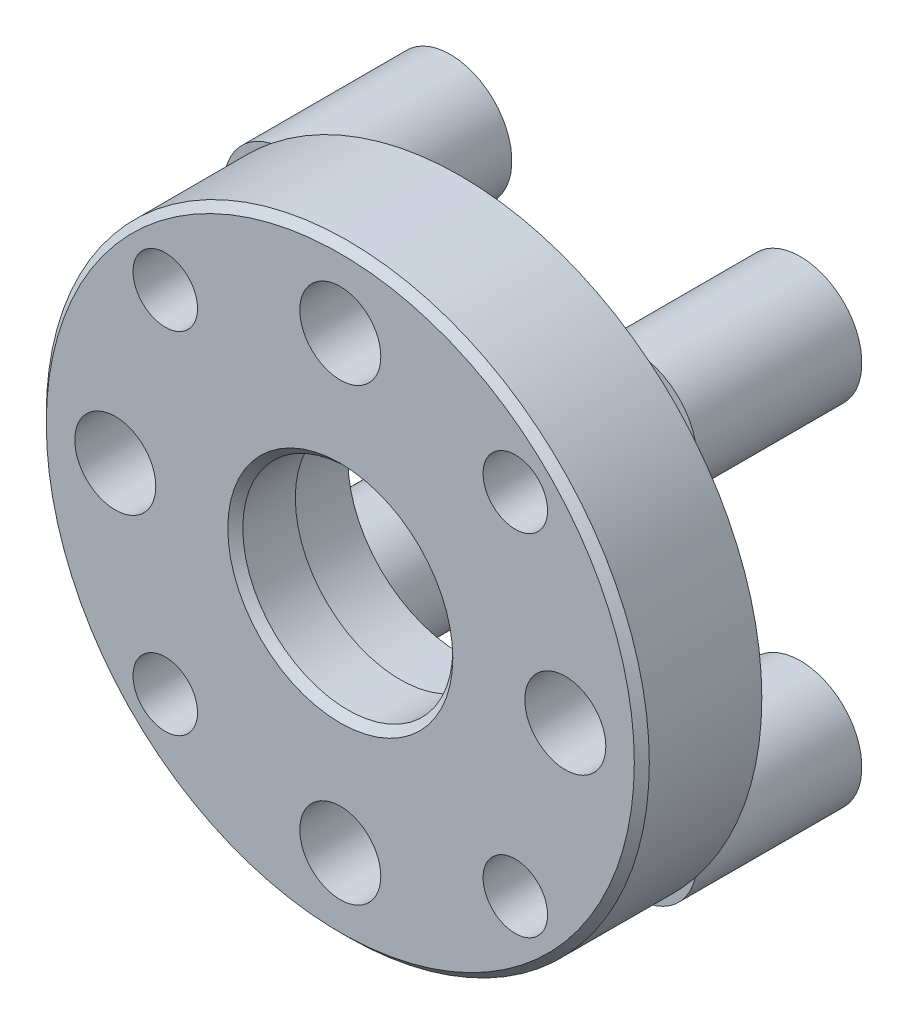
ISO-10303-21;
HEADER;
FILE_DESCRIPTION(('STEP AP214'),'2;1');
FILE_NAME('part.step','',(''),(''),'','','');
FILE_SCHEMA(('AUTOMOTIVE_DESIGN { 1 0 10303 214 1 1 1 1 }'));
ENDSEC;
DATA;
#1=APPLICATION_CONTEXT('core data for automotive mechanical design processes');
#2=APPLICATION_PROTOCOL_DEFINITION('international standard','automotive_design',2000,#1);
#3=PRODUCT_CONTEXT('',#1,'mechanical');
#4=PRODUCT('Part','Part','',(#3));
#5=PRODUCT_RELATED_PRODUCT_CATEGORY('part','',(#4));
#6=PRODUCT_DEFINITION_FORMATION('','',#4);
#7=PRODUCT_DEFINITION_CONTEXT('part definition',#1,'design');
#8=PRODUCT_DEFINITION('design','',#6,#7);
#9=PRODUCT_DEFINITION_SHAPE('','',#8);
#10=(LENGTH_UNIT() NAMED_UNIT(*) SI_UNIT(.MILLI.,.METRE.));
#11=(NAMED_UNIT(*) PLANE_ANGLE_UNIT() SI_UNIT($,.RADIAN.));
#12=(NAMED_UNIT(*) SI_UNIT($,.STERADIAN.) SOLID_ANGLE_UNIT());
#13=UNCERTAINTY_MEASURE_WITH_UNIT(LENGTH_MEASURE(1.E-05),#10,'distance_accuracy_value','');
#14=(GEOMETRIC_REPRESENTATION_CONTEXT(3) GLOBAL_UNCERTAINTY_ASSIGNED_CONTEXT((#13)) GLOBAL_UNIT_ASSIGNED_CONTEXT((#10,
#11,#12)) REPRESENTATION_CONTEXT('',''));
#15=CARTESIAN_POINT('',(0.,0.,0.));
#16=DIRECTION('',(0.,0.,1.));
#17=DIRECTION('',(1.,0.,0.));
#18=AXIS2_PLACEMENT_3D('',#15,#16,#17);
#19=CARTESIAN_POINT('',(0.,0.,-108.757942016732));
#20=DIRECTION('',(0.,0.,-1.));
#21=DIRECTION('',(-1.,0.,0.));
#22=AXIS2_PLACEMENT_3D('',#19,#20,#21);
#23=CYLINDRICAL_SURFACE('',#22,7.5);
#24=CARTESIAN_POINT('',(0.,0.,-116.757942016732));
#25=DIRECTION('',(0.,0.,1.));
#26=DIRECTION('',(1.,0.,0.));
#27=AXIS2_PLACEMENT_3D('',#24,#25,#26);
#28=CIRCLE('',#27,7.5);
#29=CARTESIAN_POINT('',(7.5,0.,-116.757942016732));
#30=VERTEX_POINT('',#29);
#31=EDGE_CURVE('E130',#30,#30,#28,.T.);
#32=ORIENTED_EDGE('',*,*,#31,.F.);
#33=EDGE_LOOP('',(#32));
#34=FACE_BOUND('',#33,.T.);
#35=CARTESIAN_POINT('',(0.,0.,-112.757942016732));
#36=DIRECTION('',(0.,0.,1.));
#37=DIRECTION('',(1.,0.,0.));
#38=AXIS2_PLACEMENT_3D('',#35,#36,#37);
#39=CIRCLE('',#38,7.5);
#40=CARTESIAN_POINT('',(7.5,0.,-112.757942016732));
#41=VERTEX_POINT('',#40);
#42=EDGE_CURVE('E342',#41,#41,#39,.T.);
#43=ORIENTED_EDGE('',*,*,#42,.T.);
#44=EDGE_LOOP('',(#43));
#45=FACE_BOUND('',#44,.T.);
#46=ADVANCED_FACE('F56',(#34,#45),#23,.F.);
#47=CARTESIAN_POINT('',(11.667261889578,-11.667261889578,-127.757942016732));
#48=DIRECTION('',(0.,0.,1.));
#49=DIRECTION('',(1.,0.,0.));
#50=AXIS2_PLACEMENT_3D('',#47,#48,#49);
#51=CYLINDRICAL_SURFACE('',#50,1.6);
#52=CARTESIAN_POINT('',(11.667261889578,-11.667261889578,-124.757942016732));
#53=DIRECTION('',(0.,0.,-1.));
#54=DIRECTION('',(-1.,0.,0.));
#55=AXIS2_PLACEMENT_3D('',#52,#53,#54);
#56=CIRCLE('',#55,1.6);
#57=CARTESIAN_POINT('',(10.067261889578,-11.667261889578,-124.757942016732));
#58=VERTEX_POINT('',#57);
#59=EDGE_CURVE('E133',#58,#58,#56,.F.);
#60=ORIENTED_EDGE('',*,*,#59,.F.);
#61=EDGE_LOOP('',(#60));
#62=FACE_BOUND('',#61,.T.);
#63=CARTESIAN_POINT('',(11.667261889578,-11.667261889578,-116.757942016732));
#64=DIRECTION('',(0.,0.,1.));
#65=DIRECTION('',(1.,0.,0.));
#66=AXIS2_PLACEMENT_3D('',#63,#64,#65);
#67=CIRCLE('',#66,1.6);
#68=CARTESIAN_POINT('',(13.267261889578,-11.667261889578,-116.757942016732));
#69=VERTEX_POINT('',#68);
#70=EDGE_CURVE('E115',#69,#69,#67,.F.);
#71=ORIENTED_EDGE('',*,*,#70,.F.);
#72=EDGE_LOOP('',(#71));
#73=FACE_BOUND('',#72,.T.);
#74=ADVANCED_FACE('F223',(#62,#73),#51,.F.);
#75=CARTESIAN_POINT('',(-11.667261889578,-11.667261889578,-127.757942016732));
#76=DIRECTION('',(0.,0.,1.));
#77=DIRECTION('',(1.,0.,0.));
#78=AXIS2_PLACEMENT_3D('',#75,#76,#77);
#79=CYLINDRICAL_SURFACE('',#78,1.6);
#80=CARTESIAN_POINT('',(-11.667261889578,-11.667261889578,-124.757942016732));
#81=DIRECTION('',(0.,0.,-1.));
#82=DIRECTION('',(-1.,0.,0.));
#83=AXIS2_PLACEMENT_3D('',#80,#81,#82);
#84=CIRCLE('',#83,1.6);
#85=CARTESIAN_POINT('',(-13.267261889578,-11.667261889578,-124.757942016732));
#86=VERTEX_POINT('',#85);
#87=EDGE_CURVE('E477',#86,#86,#84,.F.);
#88=ORIENTED_EDGE('',*,*,#87,.F.);
#89=EDGE_LOOP('',(#88));
#90=FACE_BOUND('',#89,.T.);
#91=CARTESIAN_POINT('',(-11.667261889578,-11.667261889578,-116.757942016732));
#92=DIRECTION('',(0.,0.,1.));
#93=DIRECTION('',(1.,0.,0.));
#94=AXIS2_PLACEMENT_3D('',#91,#92,#93);
#95=CIRCLE('',#94,1.6);
#96=CARTESIAN_POINT('',(-10.067261889578,-11.667261889578,-116.757942016732));
#97=VERTEX_POINT('',#96);
#98=EDGE_CURVE('E464',#97,#97,#95,.F.);
#99=ORIENTED_EDGE('',*,*,#98,.F.);
#100=EDGE_LOOP('',(#99));
#101=FACE_BOUND('',#100,.T.);
#102=ADVANCED_FACE('F231',(#90,#101),#79,.F.);
#103=CARTESIAN_POINT('',(-11.667261889578,11.667261889578,-127.757942016732));
#104=DIRECTION('',(0.,0.,1.));
#105=DIRECTION('',(1.,0.,0.));
#106=AXIS2_PLACEMENT_3D('',#103,#104,#105);
#107=CYLINDRICAL_SURFACE('',#106,1.6);
#108=CARTESIAN_POINT('',(-11.667261889578,11.667261889578,-124.757942016732));
#109=DIRECTION('',(0.,0.,-1.));
#110=DIRECTION('',(-1.,0.,0.));
#111=AXIS2_PLACEMENT_3D('',#108,#109,#110);
#112=CIRCLE('',#111,1.6);
#113=CARTESIAN_POINT('',(-13.267261889578,11.667261889578,-124.757942016732));
#114=VERTEX_POINT('',#113);
#115=EDGE_CURVE('E480',#114,#114,#112,.F.);
#116=ORIENTED_EDGE('',*,*,#115,.F.);
#117=EDGE_LOOP('',(#116));
#118=FACE_BOUND('',#117,.T.);
#119=CARTESIAN_POINT('',(-11.667261889578,11.667261889578,-116.757942016732));
#120=DIRECTION('',(0.,0.,1.));
#121=DIRECTION('',(1.,0.,0.));
#122=AXIS2_PLACEMENT_3D('',#119,#120,#121);
#123=CIRCLE('',#122,1.6);
#124=CARTESIAN_POINT('',(-10.067261889578,11.667261889578,-116.757942016732));
#125=VERTEX_POINT('',#124);
#126=EDGE_CURVE('E461',#125,#125,#123,.F.);
#127=ORIENTED_EDGE('',*,*,#126,.F.);
#128=EDGE_LOOP('',(#127));
#129=FACE_BOUND('',#128,.T.);
#130=ADVANCED_FACE('F447',(#118,#129),#107,.F.);
#131=CARTESIAN_POINT('',(11.667261889578,11.667261889578,-127.757942016732));
#132=DIRECTION('',(0.,0.,1.));
#133=DIRECTION('',(1.,0.,0.));
#134=AXIS2_PLACEMENT_3D('',#131,#132,#133);
#135=CYLINDRICAL_SURFACE('',#134,1.6);
#136=CARTESIAN_POINT('',(11.667261889578,11.667261889578,-124.757942016732));
#137=DIRECTION('',(0.,0.,-1.));
#138=DIRECTION('',(-1.,0.,0.));
#139=AXIS2_PLACEMENT_3D('',#136,#137,#138);
#140=CIRCLE('',#139,1.6);
#141=CARTESIAN_POINT('',(10.067261889578,11.667261889578,-124.757942016732));
#142=VERTEX_POINT('',#141);
#143=EDGE_CURVE('E181',#142,#142,#140,.F.);
#144=ORIENTED_EDGE('',*,*,#143,.F.);
#145=EDGE_LOOP('',(#144));
#146=FACE_BOUND('',#145,.T.);
#147=CARTESIAN_POINT('',(11.667261889578,11.667261889578,-116.757942016732));
#148=DIRECTION('',(0.,0.,1.));
#149=DIRECTION('',(1.,0.,0.));
#150=AXIS2_PLACEMENT_3D('',#147,#148,#149);
#151=CIRCLE('',#150,1.6);
#152=CARTESIAN_POINT('',(13.267261889578,11.667261889578,-116.757942016732));
#153=VERTEX_POINT('',#152);
#154=EDGE_CURVE('E313',#153,#153,#151,.F.);
#155=ORIENTED_EDGE('',*,*,#154,.F.);
#156=EDGE_LOOP('',(#155));
#157=FACE_BOUND('',#156,.T.);
#158=ADVANCED_FACE('F190',(#146,#157),#135,.F.);
#159=CARTESIAN_POINT('',(11.667261889578,11.667261889578,-127.757942016732));
#160=DIRECTION('',(0.,0.,-1.));
#161=DIRECTION('',(-1.,0.,0.));
#162=AXIS2_PLACEMENT_3D('',#159,#160,#161);
#163=PLANE('',#162);
#164=CARTESIAN_POINT('',(11.667261889578,11.667261889578,-127.757942016732));
#165=DIRECTION('',(0.,0.,-1.));
#166=DIRECTION('',(-1.,0.,0.));
#167=AXIS2_PLACEMENT_3D('',#164,#165,#166);
#168=CIRCLE('',#167,3.);
#169=CARTESIAN_POINT('',(8.66726188957803,11.667261889578,-127.757942016732));
#170=VERTEX_POINT('',#169);
#171=EDGE_CURVE('E163',#170,#170,#168,.T.);
#172=ORIENTED_EDGE('',*,*,#171,.F.);
#173=EDGE_LOOP('',(#172));
#174=FACE_BOUND('',#173,.T.);
#175=CARTESIAN_POINT('',(11.667261889578,11.667261889578,-127.757942016732));
#176=DIRECTION('',(0.,0.,-1.));
#177=DIRECTION('',(-1.,0.,0.));
#178=AXIS2_PLACEMENT_3D('',#175,#176,#177);
#179=CIRCLE('',#178,4.1);
#180=CARTESIAN_POINT('',(7.56726188957803,11.667261889578,-127.757942016732));
#181=VERTEX_POINT('',#180);
#182=EDGE_CURVE('E118',#181,#181,#179,.T.);
#183=ORIENTED_EDGE('',*,*,#182,.T.);
#184=EDGE_LOOP('',(#183));
#185=FACE_BOUND('',#184,.T.);
#186=ADVANCED_FACE('F187',(#174,#185),#163,.T.);
#187=CARTESIAN_POINT('',(11.667261889578,11.667261889578,-116.757942016732));
#188=DIRECTION('',(0.,0.,-1.));
#189=DIRECTION('',(-1.,0.,0.));
#190=AXIS2_PLACEMENT_3D('',#187,#188,#189);
#191=PLANE('',#190);
#192=CARTESIAN_POINT('',(0.,0.,-116.757942016732));
#193=DIRECTION('',(0.,0.,1.));
#194=DIRECTION('',(1.,0.,0.));
#195=AXIS2_PLACEMENT_3D('',#192,#193,#194);
#196=CIRCLE('',#195,20.1);
#197=CARTESIAN_POINT('',(15.6594660866061,12.6012349348163,-116.757942016732));
#198=VERTEX_POINT('',#197);
#199=CARTESIAN_POINT('',(12.6012349348163,15.6594660866061,-116.757942016732));
#200=VERTEX_POINT('',#199);
#201=EDGE_CURVE('E95',#198,#200,#196,.T.);
#202=ORIENTED_EDGE('',*,*,#201,.F.);
#203=CARTESIAN_POINT('',(11.667261889578,11.667261889578,-116.757942016732));
#204=DIRECTION('',(0.,0.,-1.));
#205=DIRECTION('',(-1.,0.,0.));
#206=AXIS2_PLACEMENT_3D('',#203,#204,#205);
#207=CIRCLE('',#206,4.1);
#208=EDGE_CURVE('E113',#200,#198,#207,.T.);
#209=ORIENTED_EDGE('',*,*,#208,.F.);
#210=EDGE_LOOP('',(#202,#209));
#211=FACE_BOUND('',#210,.T.);
#212=ADVANCED_FACE('F117',(#211),#191,.F.);
#213=CARTESIAN_POINT('',(0.,0.,-108.757942016732));
#214=DIRECTION('',(0.,0.,1.));
#215=DIRECTION('',(1.,0.,0.));
#216=AXIS2_PLACEMENT_3D('',#213,#214,#215);
#217=PLANE('',#216);
#218=CARTESIAN_POINT('',(0.,0.,-108.757942016732));
#219=DIRECTION('',(0.,0.,1.));
#220=DIRECTION('',(1.,0.,0.));
#221=AXIS2_PLACEMENT_3D('',#218,#219,#220);
#222=CIRCLE('',#221,7.50000000000001);
#223=CARTESIAN_POINT('',(7.50000000000001,0.,-108.757942016732));
#224=VERTEX_POINT('',#223);
#225=EDGE_CURVE('E65',#224,#224,#222,.F.);
#226=ORIENTED_EDGE('',*,*,#225,.T.);
#227=EDGE_LOOP('',(#226));
#228=FACE_BOUND('',#227,.T.);
#229=CARTESIAN_POINT('',(0.,0.,-108.757942016732));
#230=DIRECTION('',(0.,0.,1.));
#231=DIRECTION('',(1.,0.,0.));
#232=AXIS2_PLACEMENT_3D('',#229,#230,#231);
#233=CIRCLE('',#232,19.6);
#234=CARTESIAN_POINT('',(19.6,0.,-108.757942016732));
#235=VERTEX_POINT('',#234);
#236=EDGE_CURVE('E271',#235,#235,#233,.T.);
#237=ORIENTED_EDGE('',*,*,#236,.T.);
#238=EDGE_LOOP('',(#237));
#239=FACE_BOUND('',#238,.T.);
#240=CARTESIAN_POINT('',(15.,0.,-108.757942016732));
#241=DIRECTION('',(0.,0.,1.));
#242=DIRECTION('',(1.,0.,0.));
#243=AXIS2_PLACEMENT_3D('',#240,#241,#242);
#244=CIRCLE('',#243,2.7);
#245=CARTESIAN_POINT('',(17.7,0.,-108.757942016732));
#246=VERTEX_POINT('',#245);
#247=EDGE_CURVE('E283',#246,#246,#244,.T.);
#248=ORIENTED_EDGE('',*,*,#247,.F.);
#249=EDGE_LOOP('',(#248));
#250=FACE_BOUND('',#249,.T.);
#251=CARTESIAN_POINT('',(-1.04744440165294E-13,-15.,-108.757942016732));
#252=DIRECTION('',(0.,0.,1.));
#253=DIRECTION('',(1.,0.,0.));
#254=AXIS2_PLACEMENT_3D('',#251,#252,#253);
#255=CIRCLE('',#254,2.7);
#256=CARTESIAN_POINT('',(2.6999999999999,-15.,-108.757942016732));
#257=VERTEX_POINT('',#256);
#258=EDGE_CURVE('E287',#257,#257,#255,.T.);
#259=ORIENTED_EDGE('',*,*,#258,.F.);
#260=EDGE_LOOP('',(#259));
#261=FACE_BOUND('',#260,.T.);
#262=CARTESIAN_POINT('',(-15.,1.57116660247941E-13,-108.757942016732));
#263=DIRECTION('',(0.,0.,1.));
#264=DIRECTION('',(1.,0.,0.));
#265=AXIS2_PLACEMENT_3D('',#262,#263,#264);
#266=CIRCLE('',#265,2.7);
#267=CARTESIAN_POINT('',(-12.3,1.57116660247941E-13,-108.757942016732));
#268=VERTEX_POINT('',#267);
#269=EDGE_CURVE('E291',#268,#268,#266,.T.);
#270=ORIENTED_EDGE('',*,*,#269,.F.);
#271=EDGE_LOOP('',(#270));
#272=FACE_BOUND('',#271,.T.);
#273=CARTESIAN_POINT('',(-11.667261889578,11.667261889578,-108.757942016732));
#274=DIRECTION('',(0.,0.,1.));
#275=DIRECTION('',(1.,0.,0.));
#276=AXIS2_PLACEMENT_3D('',#273,#274,#275);
#277=CIRCLE('',#276,2.15);
#278=CARTESIAN_POINT('',(-9.51726188957804,11.667261889578,-108.757942016732));
#279=VERTEX_POINT('',#278);
#280=EDGE_CURVE('E295',#279,#279,#277,.T.);
#281=ORIENTED_EDGE('',*,*,#280,.F.);
#282=EDGE_LOOP('',(#281));
#283=FACE_BOUND('',#282,.T.);
#284=CARTESIAN_POINT('',(11.667261889578,11.667261889578,-108.757942016732));
#285=DIRECTION('',(0.,0.,1.));
#286=DIRECTION('',(1.,0.,0.));
#287=AXIS2_PLACEMENT_3D('',#284,#285,#286);
#288=CIRCLE('',#287,2.15);
#289=CARTESIAN_POINT('',(13.817261889578,11.667261889578,-108.757942016732));
#290=VERTEX_POINT('',#289);
#291=EDGE_CURVE('E299',#290,#290,#288,.T.);
#292=ORIENTED_EDGE('',*,*,#291,.F.);
#293=EDGE_LOOP('',(#292));
#294=FACE_BOUND('',#293,.T.);
#295=CARTESIAN_POINT('',(11.667261889578,-11.667261889578,-108.757942016732));
#296=DIRECTION('',(0.,0.,1.));
#297=DIRECTION('',(1.,0.,0.));
#298=AXIS2_PLACEMENT_3D('',#295,#296,#297);
#299=CIRCLE('',#298,2.15);
#300=CARTESIAN_POINT('',(13.817261889578,-11.667261889578,-108.757942016732));
#301=VERTEX_POINT('',#300);
#302=EDGE_CURVE('E303',#301,#301,#299,.T.);
#303=ORIENTED_EDGE('',*,*,#302,.F.);
#304=EDGE_LOOP('',(#303));
#305=FACE_BOUND('',#304,.T.);
#306=CARTESIAN_POINT('',(-11.667261889578,-11.667261889578,-108.757942016732));
#307=DIRECTION('',(0.,0.,1.));
#308=DIRECTION('',(1.,0.,0.));
#309=AXIS2_PLACEMENT_3D('',#306,#307,#308);
#310=CIRCLE('',#309,2.15);
#311=CARTESIAN_POINT('',(-9.51726188957803,-11.667261889578,-108.757942016732));
#312=VERTEX_POINT('',#311);
#313=EDGE_CURVE('E307',#312,#312,#310,.T.);
#314=ORIENTED_EDGE('',*,*,#313,.F.);
#315=EDGE_LOOP('',(#314));
#316=FACE_BOUND('',#315,.T.);
#317=CARTESIAN_POINT('',(0.,15.,-108.757942016732));
#318=DIRECTION('',(0.,0.,1.));
#319=DIRECTION('',(1.,0.,0.));
#320=AXIS2_PLACEMENT_3D('',#317,#318,#319);
#321=CIRCLE('',#320,2.7);
#322=CARTESIAN_POINT('',(2.7,15.,-108.757942016732));
#323=VERTEX_POINT('',#322);
#324=EDGE_CURVE('E199',#323,#323,#321,.T.);
#325=ORIENTED_EDGE('',*,*,#324,.F.);
#326=EDGE_LOOP('',(#325));
#327=FACE_BOUND('',#326,.T.);
#328=ADVANCED_FACE('F240',(#228,#239,#250,#261,#272,#283,#294,#305,#316,#327),#217,.T.);
#329=CARTESIAN_POINT('',(0.,0.,-116.757942016732));
#330=DIRECTION('',(0.,0.,1.));
#331=DIRECTION('',(1.,0.,0.));
#332=AXIS2_PLACEMENT_3D('',#329,#330,#331);
#333=PLANE('',#332);
#334=CARTESIAN_POINT('',(15.,0.,-116.757942016732));
#335=DIRECTION('',(0.,0.,1.));
#336=DIRECTION('',(1.,0.,0.));
#337=AXIS2_PLACEMENT_3D('',#334,#335,#336);
#338=CIRCLE('',#337,2.7);
#339=CARTESIAN_POINT('',(17.7,0.,-116.757942016732));
#340=VERTEX_POINT('',#339);
#341=EDGE_CURVE('E314',#340,#340,#338,.T.);
#342=ORIENTED_EDGE('',*,*,#341,.T.);
#343=EDGE_LOOP('',(#342));
#344=FACE_BOUND('',#343,.T.);
#345=CARTESIAN_POINT('',(-1.04744440165294E-13,-15.,-116.757942016732));
#346=DIRECTION('',(0.,0.,1.));
#347=DIRECTION('',(1.,0.,0.));
#348=AXIS2_PLACEMENT_3D('',#345,#346,#347);
#349=CIRCLE('',#348,2.7);
#350=CARTESIAN_POINT('',(2.6999999999999,-15.,-116.757942016732));
#351=VERTEX_POINT('',#350);
#352=EDGE_CURVE('E324',#351,#351,#349,.T.);
#353=ORIENTED_EDGE('',*,*,#352,.T.);
#354=EDGE_LOOP('',(#353));
#355=FACE_BOUND('',#354,.T.);
#356=CARTESIAN_POINT('',(-15.,1.57116660247941E-13,-116.757942016732));
#357=DIRECTION('',(0.,0.,1.));
#358=DIRECTION('',(1.,0.,0.));
#359=AXIS2_PLACEMENT_3D('',#356,#357,#358);
#360=CIRCLE('',#359,2.7);
#361=CARTESIAN_POINT('',(-12.3,1.57116660247941E-13,-116.757942016732));
#362=VERTEX_POINT('',#361);
#363=EDGE_CURVE('E328',#362,#362,#360,.T.);
#364=ORIENTED_EDGE('',*,*,#363,.T.);
#365=EDGE_LOOP('',(#364));
#366=FACE_BOUND('',#365,.T.);
#367=CARTESIAN_POINT('',(0.,15.,-116.757942016732));
#368=DIRECTION('',(0.,0.,1.));
#369=DIRECTION('',(1.,0.,0.));
#370=AXIS2_PLACEMENT_3D('',#367,#368,#369);
#371=CIRCLE('',#370,2.7);
#372=CARTESIAN_POINT('',(2.7,15.,-116.757942016732));
#373=VERTEX_POINT('',#372);
#374=EDGE_CURVE('E311',#373,#373,#371,.T.);
#375=ORIENTED_EDGE('',*,*,#374,.T.);
#376=EDGE_LOOP('',(#375));
#377=FACE_BOUND('',#376,.T.);
#378=CARTESIAN_POINT('',(-12.6012349348163,15.6594660866061,-116.757942016732));
#379=VERTEX_POINT('',#378);
#380=EDGE_CURVE('E99',#200,#379,#196,.T.);
#381=ORIENTED_EDGE('',*,*,#380,.F.);
#382=EDGE_CURVE('E110',#198,#200,#207,.T.);
#383=ORIENTED_EDGE('',*,*,#382,.F.);
#384=CARTESIAN_POINT('',(15.6594660866061,-12.6012349348163,-116.757942016732));
#385=VERTEX_POINT('',#384);
#386=EDGE_CURVE('E101',#385,#198,#196,.T.);
#387=ORIENTED_EDGE('',*,*,#386,.F.);
#388=CARTESIAN_POINT('',(11.667261889578,-11.667261889578,-116.757942016732));
#389=DIRECTION('',(0.,0.,-1.));
#390=DIRECTION('',(-1.,0.,0.));
#391=AXIS2_PLACEMENT_3D('',#388,#389,#390);
#392=CIRCLE('',#391,4.1);
#393=CARTESIAN_POINT('',(12.6012349348163,-15.6594660866061,-116.757942016732));
#394=VERTEX_POINT('',#393);
#395=EDGE_CURVE('E194',#394,#385,#392,.T.);
#396=ORIENTED_EDGE('',*,*,#395,.F.);
#397=CARTESIAN_POINT('',(-12.6012349348162,-15.6594660866061,-116.757942016732));
#398=VERTEX_POINT('',#397);
#399=EDGE_CURVE('E131',#398,#394,#196,.T.);
#400=ORIENTED_EDGE('',*,*,#399,.F.);
#401=CARTESIAN_POINT('',(-11.667261889578,-11.667261889578,-116.757942016732));
#402=DIRECTION('',(0.,0.,-1.));
#403=DIRECTION('',(-1.,0.,0.));
#404=AXIS2_PLACEMENT_3D('',#401,#402,#403);
#405=CIRCLE('',#404,4.1);
#406=CARTESIAN_POINT('',(-15.6594660866061,-12.6012349348163,-116.757942016732));
#407=VERTEX_POINT('',#406);
#408=EDGE_CURVE('E145',#407,#398,#405,.T.);
#409=ORIENTED_EDGE('',*,*,#408,.F.);
#410=CARTESIAN_POINT('',(-15.6594660866061,12.6012349348162,-116.757942016732));
#411=VERTEX_POINT('',#410);
#412=EDGE_CURVE('E126',#411,#407,#196,.T.);
#413=ORIENTED_EDGE('',*,*,#412,.F.);
#414=CARTESIAN_POINT('',(-11.667261889578,11.667261889578,-116.757942016732));
#415=DIRECTION('',(0.,0.,-1.));
#416=DIRECTION('',(-1.,0.,0.));
#417=AXIS2_PLACEMENT_3D('',#414,#415,#416);
#418=CIRCLE('',#417,4.1);
#419=EDGE_CURVE('E124',#379,#411,#418,.T.);
#420=ORIENTED_EDGE('',*,*,#419,.F.);
#421=EDGE_LOOP('',(#381,#383,#387,#396,#400,#409,#413,#420));
#422=FACE_BOUND('',#421,.T.);
#423=ORIENTED_EDGE('',*,*,#31,.T.);
#424=EDGE_LOOP('',(#423));
#425=FACE_BOUND('',#424,.T.);
#426=ADVANCED_FACE('F120',(#344,#355,#366,#377,#422,#425),#333,.F.);
#427=CARTESIAN_POINT('',(0.,0.,-108.757942016732));
#428=DIRECTION('',(0.,0.,-1.));
#429=DIRECTION('',(-1.,0.,0.));
#430=AXIS2_PLACEMENT_3D('',#427,#428,#429);
#431=CYLINDRICAL_SURFACE('',#430,20.1);
#432=CARTESIAN_POINT('',(0.,0.,-109.257942016732));
#433=DIRECTION('',(0.,0.,1.));
#434=DIRECTION('',(1.,0.,0.));
#435=AXIS2_PLACEMENT_3D('',#432,#433,#434);
#436=CIRCLE('',#435,20.1);
#437=CARTESIAN_POINT('',(20.1,0.,-109.257942016732));
#438=VERTEX_POINT('',#437);
#439=EDGE_CURVE('E12',#438,#438,#436,.F.);
#440=ORIENTED_EDGE('',*,*,#439,.T.);
#441=EDGE_LOOP('',(#440));
#442=FACE_BOUND('',#441,.T.);
#443=ORIENTED_EDGE('',*,*,#201,.T.);
#444=ORIENTED_EDGE('',*,*,#380,.T.);
#445=EDGE_CURVE('E107',#379,#411,#196,.T.);
#446=ORIENTED_EDGE('',*,*,#445,.T.);
#447=ORIENTED_EDGE('',*,*,#412,.T.);
#448=EDGE_CURVE('E127',#407,#398,#196,.T.);
#449=ORIENTED_EDGE('',*,*,#448,.T.);
#450=ORIENTED_EDGE('',*,*,#399,.T.);
#451=EDGE_CURVE('E72',#394,#385,#196,.T.);
#452=ORIENTED_EDGE('',*,*,#451,.T.);
#453=ORIENTED_EDGE('',*,*,#386,.T.);
#454=EDGE_LOOP('',(#443,#444,#446,#447,#449,#450,#452,#453));
#455=FACE_BOUND('',#454,.T.);
#456=ADVANCED_FACE('F97',(#442,#455),#431,.T.);
#457=CARTESIAN_POINT('',(-11.667261889578,11.667261889578,-127.757942016732));
#458=DIRECTION('',(0.,0.,-1.));
#459=DIRECTION('',(-1.,0.,0.));
#460=AXIS2_PLACEMENT_3D('',#457,#458,#459);
#461=PLANE('',#460);
#462=CARTESIAN_POINT('',(-11.667261889578,11.667261889578,-127.757942016732));
#463=DIRECTION('',(0.,0.,-1.));
#464=DIRECTION('',(-1.,0.,0.));
#465=AXIS2_PLACEMENT_3D('',#462,#463,#464);
#466=CIRCLE('',#465,3.);
#467=CARTESIAN_POINT('',(-14.667261889578,11.667261889578,-127.757942016732));
#468=VERTEX_POINT('',#467);
#469=EDGE_CURVE('E173',#468,#468,#466,.T.);
#470=ORIENTED_EDGE('',*,*,#469,.F.);
#471=EDGE_LOOP('',(#470));
#472=FACE_BOUND('',#471,.T.);
#473=CARTESIAN_POINT('',(-11.667261889578,11.667261889578,-127.757942016732));
#474=DIRECTION('',(0.,0.,-1.));
#475=DIRECTION('',(-1.,0.,0.));
#476=AXIS2_PLACEMENT_3D('',#473,#474,#475);
#477=CIRCLE('',#476,4.1);
#478=CARTESIAN_POINT('',(-15.767261889578,11.667261889578,-127.757942016732));
#479=VERTEX_POINT('',#478);
#480=EDGE_CURVE('E150',#479,#479,#477,.T.);
#481=ORIENTED_EDGE('',*,*,#480,.T.);
#482=EDGE_LOOP('',(#481));
#483=FACE_BOUND('',#482,.T.);
#484=ADVANCED_FACE('F238',(#472,#483),#461,.T.);
#485=CARTESIAN_POINT('',(-11.667261889578,11.667261889578,-116.757942016732));
#486=DIRECTION('',(0.,0.,-1.));
#487=DIRECTION('',(-1.,0.,0.));
#488=AXIS2_PLACEMENT_3D('',#485,#486,#487);
#489=PLANE('',#488);
#490=ORIENTED_EDGE('',*,*,#445,.F.);
#491=EDGE_CURVE('E155',#411,#379,#418,.T.);
#492=ORIENTED_EDGE('',*,*,#491,.F.);
#493=EDGE_LOOP('',(#490,#492));
#494=FACE_BOUND('',#493,.T.);
#495=ADVANCED_FACE('F680',(#494),#489,.F.);
#496=CARTESIAN_POINT('',(-11.667261889578,-11.667261889578,-127.757942016732));
#497=DIRECTION('',(0.,0.,-1.));
#498=DIRECTION('',(-1.,0.,0.));
#499=AXIS2_PLACEMENT_3D('',#496,#497,#498);
#500=PLANE('',#499);
#501=CARTESIAN_POINT('',(-11.667261889578,-11.667261889578,-127.757942016732));
#502=DIRECTION('',(0.,0.,-1.));
#503=DIRECTION('',(-1.,0.,0.));
#504=AXIS2_PLACEMENT_3D('',#501,#502,#503);
#505=CIRCLE('',#504,3.);
#506=CARTESIAN_POINT('',(-14.667261889578,-11.667261889578,-127.757942016732));
#507=VERTEX_POINT('',#506);
#508=EDGE_CURVE('E167',#507,#507,#505,.T.);
#509=ORIENTED_EDGE('',*,*,#508,.F.);
#510=EDGE_LOOP('',(#509));
#511=FACE_BOUND('',#510,.T.);
#512=CARTESIAN_POINT('',(-11.667261889578,-11.667261889578,-127.757942016732));
#513=DIRECTION('',(0.,0.,-1.));
#514=DIRECTION('',(-1.,0.,0.));
#515=AXIS2_PLACEMENT_3D('',#512,#513,#514);
#516=CIRCLE('',#515,4.1);
#517=CARTESIAN_POINT('',(-15.767261889578,-11.667261889578,-127.757942016732));
#518=VERTEX_POINT('',#517);
#519=EDGE_CURVE('E147',#518,#518,#516,.T.);
#520=ORIENTED_EDGE('',*,*,#519,.T.);
#521=EDGE_LOOP('',(#520));
#522=FACE_BOUND('',#521,.T.);
#523=ADVANCED_FACE('F689',(#511,#522),#500,.T.);
#524=CARTESIAN_POINT('',(-11.667261889578,-11.667261889578,-116.757942016732));
#525=DIRECTION('',(0.,0.,-1.));
#526=DIRECTION('',(-1.,0.,0.));
#527=AXIS2_PLACEMENT_3D('',#524,#525,#526);
#528=PLANE('',#527);
#529=ORIENTED_EDGE('',*,*,#448,.F.);
#530=EDGE_CURVE('E142',#398,#407,#405,.T.);
#531=ORIENTED_EDGE('',*,*,#530,.F.);
#532=EDGE_LOOP('',(#529,#531));
#533=FACE_BOUND('',#532,.T.);
#534=ADVANCED_FACE('F218',(#533),#528,.F.);
#535=CARTESIAN_POINT('',(11.667261889578,-11.667261889578,-127.757942016732));
#536=DIRECTION('',(0.,0.,-1.));
#537=DIRECTION('',(-1.,0.,0.));
#538=AXIS2_PLACEMENT_3D('',#535,#536,#537);
#539=PLANE('',#538);
#540=CARTESIAN_POINT('',(11.667261889578,-11.667261889578,-127.757942016732));
#541=DIRECTION('',(0.,0.,-1.));
#542=DIRECTION('',(-1.,0.,0.));
#543=AXIS2_PLACEMENT_3D('',#540,#541,#542);
#544=CIRCLE('',#543,3.);
#545=CARTESIAN_POINT('',(8.66726188957804,-11.667261889578,-127.757942016732));
#546=VERTEX_POINT('',#545);
#547=EDGE_CURVE('E160',#546,#546,#544,.T.);
#548=ORIENTED_EDGE('',*,*,#547,.F.);
#549=EDGE_LOOP('',(#548));
#550=FACE_BOUND('',#549,.T.);
#551=CARTESIAN_POINT('',(11.667261889578,-11.667261889578,-127.757942016732));
#552=DIRECTION('',(0.,0.,-1.));
#553=DIRECTION('',(-1.,0.,0.));
#554=AXIS2_PLACEMENT_3D('',#551,#552,#553);
#555=CIRCLE('',#554,4.1);
#556=CARTESIAN_POINT('',(7.56726188957804,-11.667261889578,-127.757942016732));
#557=VERTEX_POINT('',#556);
#558=EDGE_CURVE('E152',#557,#557,#555,.T.);
#559=ORIENTED_EDGE('',*,*,#558,.T.);
#560=EDGE_LOOP('',(#559));
#561=FACE_BOUND('',#560,.T.);
#562=ADVANCED_FACE('F209',(#550,#561),#539,.T.);
#563=CARTESIAN_POINT('',(11.667261889578,-11.667261889578,-116.757942016732));
#564=DIRECTION('',(0.,0.,-1.));
#565=DIRECTION('',(-1.,0.,0.));
#566=AXIS2_PLACEMENT_3D('',#563,#564,#565);
#567=PLANE('',#566);
#568=ORIENTED_EDGE('',*,*,#451,.F.);
#569=EDGE_CURVE('E197',#385,#394,#392,.T.);
#570=ORIENTED_EDGE('',*,*,#569,.F.);
#571=EDGE_LOOP('',(#568,#570));
#572=FACE_BOUND('',#571,.T.);
#573=ADVANCED_FACE('F206',(#572),#567,.F.);
#574=CARTESIAN_POINT('',(11.667261889578,11.667261889578,-124.757942016732));
#575=DIRECTION('',(0.,0.,-1.));
#576=DIRECTION('',(-1.,0.,0.));
#577=AXIS2_PLACEMENT_3D('',#574,#575,#576);
#578=PLANE('',#577);
#579=CARTESIAN_POINT('',(11.667261889578,11.667261889578,-124.757942016732));
#580=DIRECTION('',(0.,0.,-1.));
#581=DIRECTION('',(-1.,0.,0.));
#582=AXIS2_PLACEMENT_3D('',#579,#580,#581);
#583=CIRCLE('',#582,3.);
#584=CARTESIAN_POINT('',(8.66726188957803,11.667261889578,-124.757942016732));
#585=VERTEX_POINT('',#584);
#586=EDGE_CURVE('E178',#585,#585,#583,.T.);
#587=ORIENTED_EDGE('',*,*,#586,.T.);
#588=EDGE_LOOP('',(#587));
#589=FACE_BOUND('',#588,.T.);
#590=ORIENTED_EDGE('',*,*,#143,.T.);
#591=EDGE_LOOP('',(#590));
#592=FACE_BOUND('',#591,.T.);
#593=ADVANCED_FACE('F208',(#589,#592),#578,.T.);
#594=CARTESIAN_POINT('',(11.667261889578,11.667261889578,-124.757942016732));
#595=DIRECTION('',(0.,0.,-1.));
#596=DIRECTION('',(-1.,0.,0.));
#597=AXIS2_PLACEMENT_3D('',#594,#595,#596);
#598=CYLINDRICAL_SURFACE('',#597,3.);
#599=ORIENTED_EDGE('',*,*,#586,.F.);
#600=EDGE_LOOP('',(#599));
#601=FACE_BOUND('',#600,.T.);
#602=ORIENTED_EDGE('',*,*,#171,.T.);
#603=EDGE_LOOP('',(#602));
#604=FACE_BOUND('',#603,.T.);
#605=ADVANCED_FACE('F185',(#601,#604),#598,.F.);
#606=CARTESIAN_POINT('',(-11.667261889578,11.667261889578,-124.757942016732));
#607=DIRECTION('',(0.,0.,-1.));
#608=DIRECTION('',(-1.,0.,0.));
#609=AXIS2_PLACEMENT_3D('',#606,#607,#608);
#610=PLANE('',#609);
#611=CARTESIAN_POINT('',(-11.667261889578,11.667261889578,-124.757942016732));
#612=DIRECTION('',(0.,0.,-1.));
#613=DIRECTION('',(-1.,0.,0.));
#614=AXIS2_PLACEMENT_3D('',#611,#612,#613);
#615=CIRCLE('',#614,3.);
#616=CARTESIAN_POINT('',(-14.667261889578,11.667261889578,-124.757942016732));
#617=VERTEX_POINT('',#616);
#618=EDGE_CURVE('E157',#617,#617,#615,.T.);
#619=ORIENTED_EDGE('',*,*,#618,.T.);
#620=EDGE_LOOP('',(#619));
#621=FACE_BOUND('',#620,.T.);
#622=ORIENTED_EDGE('',*,*,#115,.T.);
#623=EDGE_LOOP('',(#622));
#624=FACE_BOUND('',#623,.T.);
#625=ADVANCED_FACE('F437',(#621,#624),#610,.T.);
#626=CARTESIAN_POINT('',(-11.667261889578,11.667261889578,-124.757942016732));
#627=DIRECTION('',(0.,0.,-1.));
#628=DIRECTION('',(-1.,0.,0.));
#629=AXIS2_PLACEMENT_3D('',#626,#627,#628);
#630=CYLINDRICAL_SURFACE('',#629,3.);
#631=ORIENTED_EDGE('',*,*,#618,.F.);
#632=EDGE_LOOP('',(#631));
#633=FACE_BOUND('',#632,.T.);
#634=ORIENTED_EDGE('',*,*,#469,.T.);
#635=EDGE_LOOP('',(#634));
#636=FACE_BOUND('',#635,.T.);
#637=ADVANCED_FACE('F433',(#633,#636),#630,.F.);
#638=CARTESIAN_POINT('',(-11.667261889578,-11.667261889578,-124.757942016732));
#639=DIRECTION('',(0.,0.,-1.));
#640=DIRECTION('',(-1.,0.,0.));
#641=AXIS2_PLACEMENT_3D('',#638,#639,#640);
#642=PLANE('',#641);
#643=CARTESIAN_POINT('',(-11.667261889578,-11.667261889578,-124.757942016732));
#644=DIRECTION('',(0.,0.,-1.));
#645=DIRECTION('',(-1.,0.,0.));
#646=AXIS2_PLACEMENT_3D('',#643,#644,#645);
#647=CIRCLE('',#646,3.);
#648=CARTESIAN_POINT('',(-14.667261889578,-11.667261889578,-124.757942016732));
#649=VERTEX_POINT('',#648);
#650=EDGE_CURVE('E170',#649,#649,#647,.T.);
#651=ORIENTED_EDGE('',*,*,#650,.T.);
#652=EDGE_LOOP('',(#651));
#653=FACE_BOUND('',#652,.T.);
#654=ORIENTED_EDGE('',*,*,#87,.T.);
#655=EDGE_LOOP('',(#654));
#656=FACE_BOUND('',#655,.T.);
#657=ADVANCED_FACE('F429',(#653,#656),#642,.T.);
#658=CARTESIAN_POINT('',(-11.667261889578,-11.667261889578,-124.757942016732));
#659=DIRECTION('',(0.,0.,-1.));
#660=DIRECTION('',(-1.,0.,0.));
#661=AXIS2_PLACEMENT_3D('',#658,#659,#660);
#662=CYLINDRICAL_SURFACE('',#661,3.);
#663=ORIENTED_EDGE('',*,*,#650,.F.);
#664=EDGE_LOOP('',(#663));
#665=FACE_BOUND('',#664,.T.);
#666=ORIENTED_EDGE('',*,*,#508,.T.);
#667=EDGE_LOOP('',(#666));
#668=FACE_BOUND('',#667,.T.);
#669=ADVANCED_FACE('F425',(#665,#668),#662,.F.);
#670=CARTESIAN_POINT('',(11.667261889578,-11.667261889578,-124.757942016732));
#671=DIRECTION('',(0.,0.,-1.));
#672=DIRECTION('',(-1.,0.,0.));
#673=AXIS2_PLACEMENT_3D('',#670,#671,#672);
#674=PLANE('',#673);
#675=CARTESIAN_POINT('',(11.667261889578,-11.667261889578,-124.757942016732));
#676=DIRECTION('',(0.,0.,-1.));
#677=DIRECTION('',(-1.,0.,0.));
#678=AXIS2_PLACEMENT_3D('',#675,#676,#677);
#679=CIRCLE('',#678,3.);
#680=CARTESIAN_POINT('',(8.66726188957804,-11.667261889578,-124.757942016732));
#681=VERTEX_POINT('',#680);
#682=EDGE_CURVE('E164',#681,#681,#679,.T.);
#683=ORIENTED_EDGE('',*,*,#682,.T.);
#684=EDGE_LOOP('',(#683));
#685=FACE_BOUND('',#684,.T.);
#686=ORIENTED_EDGE('',*,*,#59,.T.);
#687=EDGE_LOOP('',(#686));
#688=FACE_BOUND('',#687,.T.);
#689=ADVANCED_FACE('F421',(#685,#688),#674,.T.);
#690=CARTESIAN_POINT('',(11.667261889578,-11.667261889578,-124.757942016732));
#691=DIRECTION('',(0.,0.,-1.));
#692=DIRECTION('',(-1.,0.,0.));
#693=AXIS2_PLACEMENT_3D('',#690,#691,#692);
#694=CYLINDRICAL_SURFACE('',#693,3.);
#695=ORIENTED_EDGE('',*,*,#682,.F.);
#696=EDGE_LOOP('',(#695));
#697=FACE_BOUND('',#696,.T.);
#698=ORIENTED_EDGE('',*,*,#547,.T.);
#699=EDGE_LOOP('',(#698));
#700=FACE_BOUND('',#699,.T.);
#701=ADVANCED_FACE('F417',(#697,#700),#694,.F.);
#702=CARTESIAN_POINT('',(-11.667261889578,11.667261889578,-116.757942016732));
#703=DIRECTION('',(0.,0.,-1.));
#704=DIRECTION('',(-1.,0.,0.));
#705=AXIS2_PLACEMENT_3D('',#702,#703,#704);
#706=CYLINDRICAL_SURFACE('',#705,4.1);
#707=ORIENTED_EDGE('',*,*,#491,.T.);
#708=ORIENTED_EDGE('',*,*,#419,.T.);
#709=EDGE_LOOP('',(#707,#708));
#710=FACE_BOUND('',#709,.T.);
#711=ORIENTED_EDGE('',*,*,#480,.F.);
#712=EDGE_LOOP('',(#711));
#713=FACE_BOUND('',#712,.T.);
#714=ADVANCED_FACE('F415',(#710,#713),#706,.T.);
#715=CARTESIAN_POINT('',(-11.667261889578,-11.667261889578,-116.757942016732));
#716=DIRECTION('',(0.,0.,-1.));
#717=DIRECTION('',(-1.,0.,0.));
#718=AXIS2_PLACEMENT_3D('',#715,#716,#717);
#719=CYLINDRICAL_SURFACE('',#718,4.1);
#720=ORIENTED_EDGE('',*,*,#530,.T.);
#721=ORIENTED_EDGE('',*,*,#408,.T.);
#722=EDGE_LOOP('',(#720,#721));
#723=FACE_BOUND('',#722,.T.);
#724=ORIENTED_EDGE('',*,*,#519,.F.);
#725=EDGE_LOOP('',(#724));
#726=FACE_BOUND('',#725,.T.);
#727=ADVANCED_FACE('F143',(#723,#726),#719,.T.);
#728=CARTESIAN_POINT('',(11.667261889578,-11.667261889578,-116.757942016732));
#729=DIRECTION('',(0.,0.,-1.));
#730=DIRECTION('',(-1.,0.,0.));
#731=AXIS2_PLACEMENT_3D('',#728,#729,#730);
#732=CYLINDRICAL_SURFACE('',#731,4.1);
#733=ORIENTED_EDGE('',*,*,#569,.T.);
#734=ORIENTED_EDGE('',*,*,#395,.T.);
#735=EDGE_LOOP('',(#733,#734));
#736=FACE_BOUND('',#735,.T.);
#737=ORIENTED_EDGE('',*,*,#558,.F.);
#738=EDGE_LOOP('',(#737));
#739=FACE_BOUND('',#738,.T.);
#740=ADVANCED_FACE('F204',(#736,#739),#732,.T.);
#741=CARTESIAN_POINT('',(11.667261889578,11.667261889578,-116.757942016732));
#742=DIRECTION('',(0.,0.,-1.));
#743=DIRECTION('',(-1.,0.,0.));
#744=AXIS2_PLACEMENT_3D('',#741,#742,#743);
#745=CYLINDRICAL_SURFACE('',#744,4.1);
#746=ORIENTED_EDGE('',*,*,#208,.T.);
#747=ORIENTED_EDGE('',*,*,#382,.T.);
#748=EDGE_LOOP('',(#746,#747));
#749=FACE_BOUND('',#748,.T.);
#750=ORIENTED_EDGE('',*,*,#182,.F.);
#751=EDGE_LOOP('',(#750));
#752=FACE_BOUND('',#751,.T.);
#753=ADVANCED_FACE('F111',(#749,#752),#745,.T.);
#754=CARTESIAN_POINT('',(0.,15.,-116.757942016732));
#755=DIRECTION('',(0.,0.,1.));
#756=DIRECTION('',(1.,0.,0.));
#757=AXIS2_PLACEMENT_3D('',#754,#755,#756);
#758=CYLINDRICAL_SURFACE('',#757,2.7);
#759=ORIENTED_EDGE('',*,*,#374,.F.);
#760=EDGE_LOOP('',(#759));
#761=FACE_BOUND('',#760,.T.);
#762=ORIENTED_EDGE('',*,*,#324,.T.);
#763=EDGE_LOOP('',(#762));
#764=FACE_BOUND('',#763,.T.);
#765=ADVANCED_FACE('F401',(#761,#764),#758,.F.);
#766=CARTESIAN_POINT('',(-15.,1.57116660247941E-13,-116.757942016732));
#767=DIRECTION('',(0.,0.,1.));
#768=DIRECTION('',(1.,0.,0.));
#769=AXIS2_PLACEMENT_3D('',#766,#767,#768);
#770=CYLINDRICAL_SURFACE('',#769,2.7);
#771=ORIENTED_EDGE('',*,*,#363,.F.);
#772=EDGE_LOOP('',(#771));
#773=FACE_BOUND('',#772,.T.);
#774=ORIENTED_EDGE('',*,*,#269,.T.);
#775=EDGE_LOOP('',(#774));
#776=FACE_BOUND('',#775,.T.);
#777=ADVANCED_FACE('F398',(#773,#776),#770,.F.);
#778=CARTESIAN_POINT('',(-1.04744440165294E-13,-15.,-116.757942016732));
#779=DIRECTION('',(0.,0.,1.));
#780=DIRECTION('',(1.,0.,0.));
#781=AXIS2_PLACEMENT_3D('',#778,#779,#780);
#782=CYLINDRICAL_SURFACE('',#781,2.7);
#783=ORIENTED_EDGE('',*,*,#352,.F.);
#784=EDGE_LOOP('',(#783));
#785=FACE_BOUND('',#784,.T.);
#786=ORIENTED_EDGE('',*,*,#258,.T.);
#787=EDGE_LOOP('',(#786));
#788=FACE_BOUND('',#787,.T.);
#789=ADVANCED_FACE('F394',(#785,#788),#782,.F.);
#790=CARTESIAN_POINT('',(15.,0.,-116.757942016732));
#791=DIRECTION('',(0.,0.,1.));
#792=DIRECTION('',(1.,0.,0.));
#793=AXIS2_PLACEMENT_3D('',#790,#791,#792);
#794=CYLINDRICAL_SURFACE('',#793,2.7);
#795=ORIENTED_EDGE('',*,*,#341,.F.);
#796=EDGE_LOOP('',(#795));
#797=FACE_BOUND('',#796,.T.);
#798=ORIENTED_EDGE('',*,*,#247,.T.);
#799=EDGE_LOOP('',(#798));
#800=FACE_BOUND('',#799,.T.);
#801=ADVANCED_FACE('F391',(#797,#800),#794,.F.);
#802=CARTESIAN_POINT('',(-11.667261889578,-11.667261889578,-116.757942016732));
#803=DIRECTION('',(0.,0.,1.));
#804=DIRECTION('',(1.,0.,0.));
#805=AXIS2_PLACEMENT_3D('',#802,#803,#804);
#806=PLANE('',#805);
#807=CARTESIAN_POINT('',(-11.667261889578,-11.667261889578,-116.757942016732));
#808=DIRECTION('',(0.,0.,1.));
#809=DIRECTION('',(1.,0.,0.));
#810=AXIS2_PLACEMENT_3D('',#807,#808,#809);
#811=CIRCLE('',#810,2.15);
#812=CARTESIAN_POINT('',(-9.51726188957803,-11.667261889578,-116.757942016732));
#813=VERTEX_POINT('',#812);
#814=EDGE_CURVE('E320',#813,#813,#811,.T.);
#815=ORIENTED_EDGE('',*,*,#814,.T.);
#816=EDGE_LOOP('',(#815));
#817=FACE_BOUND('',#816,.T.);
#818=ORIENTED_EDGE('',*,*,#98,.T.);
#819=EDGE_LOOP('',(#818));
#820=FACE_BOUND('',#819,.T.);
#821=ADVANCED_FACE('F387',(#817,#820),#806,.T.);
#822=CARTESIAN_POINT('',(-11.667261889578,-11.667261889578,-116.757942016732));
#823=DIRECTION('',(0.,0.,1.));
#824=DIRECTION('',(1.,0.,0.));
#825=AXIS2_PLACEMENT_3D('',#822,#823,#824);
#826=CYLINDRICAL_SURFACE('',#825,2.15);
#827=ORIENTED_EDGE('',*,*,#814,.F.);
#828=EDGE_LOOP('',(#827));
#829=FACE_BOUND('',#828,.T.);
#830=ORIENTED_EDGE('',*,*,#313,.T.);
#831=EDGE_LOOP('',(#830));
#832=FACE_BOUND('',#831,.T.);
#833=ADVANCED_FACE('F383',(#829,#832),#826,.F.);
#834=CARTESIAN_POINT('',(11.667261889578,-11.667261889578,-116.757942016732));
#835=DIRECTION('',(0.,0.,1.));
#836=DIRECTION('',(1.,0.,0.));
#837=AXIS2_PLACEMENT_3D('',#834,#835,#836);
#838=PLANE('',#837);
#839=CARTESIAN_POINT('',(11.667261889578,-11.667261889578,-116.757942016732));
#840=DIRECTION('',(0.,0.,1.));
#841=DIRECTION('',(1.,0.,0.));
#842=AXIS2_PLACEMENT_3D('',#839,#840,#841);
#843=CIRCLE('',#842,2.15);
#844=CARTESIAN_POINT('',(13.817261889578,-11.667261889578,-116.757942016732));
#845=VERTEX_POINT('',#844);
#846=EDGE_CURVE('E346',#845,#845,#843,.T.);
#847=ORIENTED_EDGE('',*,*,#846,.T.);
#848=EDGE_LOOP('',(#847));
#849=FACE_BOUND('',#848,.T.);
#850=ORIENTED_EDGE('',*,*,#70,.T.);
#851=EDGE_LOOP('',(#850));
#852=FACE_BOUND('',#851,.T.);
#853=ADVANCED_FACE('F379',(#849,#852),#838,.T.);
#854=CARTESIAN_POINT('',(11.667261889578,-11.667261889578,-116.757942016732));
#855=DIRECTION('',(0.,0.,1.));
#856=DIRECTION('',(1.,0.,0.));
#857=AXIS2_PLACEMENT_3D('',#854,#855,#856);
#858=CYLINDRICAL_SURFACE('',#857,2.15);
#859=ORIENTED_EDGE('',*,*,#846,.F.);
#860=EDGE_LOOP('',(#859));
#861=FACE_BOUND('',#860,.T.);
#862=ORIENTED_EDGE('',*,*,#302,.T.);
#863=EDGE_LOOP('',(#862));
#864=FACE_BOUND('',#863,.T.);
#865=ADVANCED_FACE('F375',(#861,#864),#858,.F.);
#866=CARTESIAN_POINT('',(11.667261889578,11.667261889578,-116.757942016732));
#867=DIRECTION('',(0.,0.,1.));
#868=DIRECTION('',(1.,0.,0.));
#869=AXIS2_PLACEMENT_3D('',#866,#867,#868);
#870=PLANE('',#869);
#871=CARTESIAN_POINT('',(11.667261889578,11.667261889578,-116.757942016732));
#872=DIRECTION('',(0.,0.,1.));
#873=DIRECTION('',(1.,0.,0.));
#874=AXIS2_PLACEMENT_3D('',#871,#872,#873);
#875=CIRCLE('',#874,2.15);
#876=CARTESIAN_POINT('',(13.817261889578,11.667261889578,-116.757942016732));
#877=VERTEX_POINT('',#876);
#878=EDGE_CURVE('E336',#877,#877,#875,.T.);
#879=ORIENTED_EDGE('',*,*,#878,.T.);
#880=EDGE_LOOP('',(#879));
#881=FACE_BOUND('',#880,.T.);
#882=ORIENTED_EDGE('',*,*,#154,.T.);
#883=EDGE_LOOP('',(#882));
#884=FACE_BOUND('',#883,.T.);
#885=ADVANCED_FACE('F371',(#881,#884),#870,.T.);
#886=CARTESIAN_POINT('',(11.667261889578,11.667261889578,-116.757942016732));
#887=DIRECTION('',(0.,0.,1.));
#888=DIRECTION('',(1.,0.,0.));
#889=AXIS2_PLACEMENT_3D('',#886,#887,#888);
#890=CYLINDRICAL_SURFACE('',#889,2.15);
#891=ORIENTED_EDGE('',*,*,#878,.F.);
#892=EDGE_LOOP('',(#891));
#893=FACE_BOUND('',#892,.T.);
#894=ORIENTED_EDGE('',*,*,#291,.T.);
#895=EDGE_LOOP('',(#894));
#896=FACE_BOUND('',#895,.T.);
#897=ADVANCED_FACE('F368',(#893,#896),#890,.F.);
#898=CARTESIAN_POINT('',(-11.667261889578,11.667261889578,-116.757942016732));
#899=DIRECTION('',(0.,0.,1.));
#900=DIRECTION('',(1.,0.,0.));
#901=AXIS2_PLACEMENT_3D('',#898,#899,#900);
#902=PLANE('',#901);
#903=CARTESIAN_POINT('',(-11.667261889578,11.667261889578,-116.757942016732));
#904=DIRECTION('',(0.,0.,1.));
#905=DIRECTION('',(1.,0.,0.));
#906=AXIS2_PLACEMENT_3D('',#903,#904,#905);
#907=CIRCLE('',#906,2.15);
#908=CARTESIAN_POINT('',(-9.51726188957804,11.667261889578,-116.757942016732));
#909=VERTEX_POINT('',#908);
#910=EDGE_CURVE('E332',#909,#909,#907,.T.);
#911=ORIENTED_EDGE('',*,*,#910,.T.);
#912=EDGE_LOOP('',(#911));
#913=FACE_BOUND('',#912,.T.);
#914=ORIENTED_EDGE('',*,*,#126,.T.);
#915=EDGE_LOOP('',(#914));
#916=FACE_BOUND('',#915,.T.);
#917=ADVANCED_FACE('F364',(#913,#916),#902,.T.);
#918=CARTESIAN_POINT('',(-11.667261889578,11.667261889578,-116.757942016732));
#919=DIRECTION('',(0.,0.,1.));
#920=DIRECTION('',(1.,0.,0.));
#921=AXIS2_PLACEMENT_3D('',#918,#919,#920);
#922=CYLINDRICAL_SURFACE('',#921,2.15);
#923=ORIENTED_EDGE('',*,*,#910,.F.);
#924=EDGE_LOOP('',(#923));
#925=FACE_BOUND('',#924,.T.);
#926=ORIENTED_EDGE('',*,*,#280,.T.);
#927=EDGE_LOOP('',(#926));
#928=FACE_BOUND('',#927,.T.);
#929=ADVANCED_FACE('F360',(#925,#928),#922,.F.);
#930=CARTESIAN_POINT('',(0.,0.,-112.757942016732));
#931=DIRECTION('',(0.,0.,1.));
#932=DIRECTION('',(1.,0.,0.));
#933=AXIS2_PLACEMENT_3D('',#930,#931,#932);
#934=PLANE('',#933);
#935=CARTESIAN_POINT('',(0.,0.,-112.757942016732));
#936=DIRECTION('',(0.,0.,1.));
#937=DIRECTION('',(1.,0.,0.));
#938=AXIS2_PLACEMENT_3D('',#935,#936,#937);
#939=CIRCLE('',#938,7.);
#940=CARTESIAN_POINT('',(7.,0.,-112.757942016732));
#941=VERTEX_POINT('',#940);
#942=EDGE_CURVE('E353',#941,#941,#939,.T.);
#943=ORIENTED_EDGE('',*,*,#942,.T.);
#944=EDGE_LOOP('',(#943));
#945=FACE_BOUND('',#944,.T.);
#946=ORIENTED_EDGE('',*,*,#42,.F.);
#947=EDGE_LOOP('',(#946));
#948=FACE_BOUND('',#947,.T.);
#949=ADVANCED_FACE('F263',(#945,#948),#934,.F.);
#950=CARTESIAN_POINT('',(0.,0.,-112.757942016732));
#951=DIRECTION('',(0.,0.,1.));
#952=DIRECTION('',(1.,0.,0.));
#953=AXIS2_PLACEMENT_3D('',#950,#951,#952);
#954=CYLINDRICAL_SURFACE('',#953,7.);
#955=CARTESIAN_POINT('',(0.,0.,-109.257942016732));
#956=DIRECTION('',(0.,0.,1.));
#957=DIRECTION('',(1.,0.,0.));
#958=AXIS2_PLACEMENT_3D('',#955,#956,#957);
#959=CIRCLE('',#958,7.);
#960=CARTESIAN_POINT('',(7.,0.,-109.257942016732));
#961=VERTEX_POINT('',#960);
#962=EDGE_CURVE('E105',#961,#961,#959,.T.);
#963=ORIENTED_EDGE('',*,*,#962,.T.);
#964=EDGE_LOOP('',(#963));
#965=FACE_BOUND('',#964,.T.);
#966=ORIENTED_EDGE('',*,*,#942,.F.);
#967=EDGE_LOOP('',(#966));
#968=FACE_BOUND('',#967,.T.);
#969=ADVANCED_FACE('F256',(#965,#968),#954,.F.);
#970=CARTESIAN_POINT('',(0.,0.,-109.257942016732));
#971=DIRECTION('',(0.,0.,1.));
#972=DIRECTION('',(1.,0.,0.));
#973=AXIS2_PLACEMENT_3D('',#970,#971,#972);
#974=CONICAL_SURFACE('',#973,7.,0.785398163397441);
#975=ORIENTED_EDGE('',*,*,#225,.F.);
#976=EDGE_LOOP('',(#975));
#977=FACE_BOUND('',#976,.T.);
#978=ORIENTED_EDGE('',*,*,#962,.F.);
#979=EDGE_LOOP('',(#978));
#980=FACE_BOUND('',#979,.T.);
#981=ADVANCED_FACE('F252',(#977,#980),#974,.F.);
#982=CARTESIAN_POINT('',(0.,0.,-108.757942016732));
#983=DIRECTION('',(0.,0.,-1.));
#984=DIRECTION('',(-1.,0.,0.));
#985=AXIS2_PLACEMENT_3D('',#982,#983,#984);
#986=CONICAL_SURFACE('',#985,19.6,0.785398163397448);
#987=ORIENTED_EDGE('',*,*,#439,.F.);
#988=EDGE_LOOP('',(#987));
#989=FACE_BOUND('',#988,.T.);
#990=ORIENTED_EDGE('',*,*,#236,.F.);
#991=EDGE_LOOP('',(#990));
#992=FACE_BOUND('',#991,.T.);
#993=ADVANCED_FACE('F59',(#989,#992),#986,.T.);
#994=CLOSED_SHELL('',(#46,#74,#102,#130,#158,#186,#212,#328,#426,#456,#484,#495,#523,#534,#562,
#573,#593,#605,#625,#637,#657,#669,#689,#701,#714,#727,#740,#753,#765,#777,#789,#801,#821,#833,
#853,#865,#885,#897,#917,#929,#949,#969,#981,#993));
#995=MANIFOLD_SOLID_BREP('B2',#994);
#996=ADVANCED_BREP_SHAPE_REPRESENTATION('',(#18,#995),#14);
#997=SHAPE_DEFINITION_REPRESENTATION(#9,#996);
ENDSEC;
END-ISO-10303-21;
